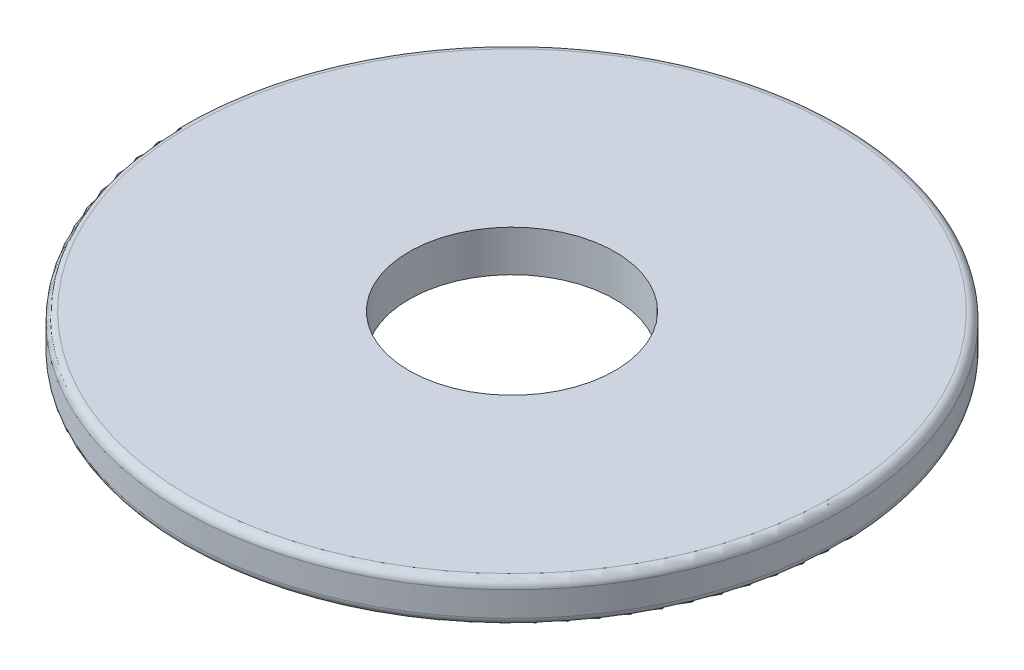
ISO-10303-21;
HEADER;
FILE_DESCRIPTION(('STEP AP214'),'2;1');
FILE_NAME('part.step','',(''),(''),'','','');
FILE_SCHEMA(('AUTOMOTIVE_DESIGN { 1 0 10303 214 1 1 1 1 }'));
ENDSEC;
DATA;
#1=APPLICATION_CONTEXT('core data for automotive mechanical design processes');
#2=APPLICATION_PROTOCOL_DEFINITION('international standard','automotive_design',2000,#1);
#3=PRODUCT_CONTEXT('',#1,'mechanical');
#4=PRODUCT('Part','Part','',(#3));
#5=PRODUCT_RELATED_PRODUCT_CATEGORY('part','',(#4));
#6=PRODUCT_DEFINITION_FORMATION('','',#4);
#7=PRODUCT_DEFINITION_CONTEXT('part definition',#1,'design');
#8=PRODUCT_DEFINITION('design','',#6,#7);
#9=PRODUCT_DEFINITION_SHAPE('','',#8);
#10=(LENGTH_UNIT() NAMED_UNIT(*) SI_UNIT(.MILLI.,.METRE.));
#11=(NAMED_UNIT(*) PLANE_ANGLE_UNIT() SI_UNIT($,.RADIAN.));
#12=(NAMED_UNIT(*) SI_UNIT($,.STERADIAN.) SOLID_ANGLE_UNIT());
#13=UNCERTAINTY_MEASURE_WITH_UNIT(LENGTH_MEASURE(1.E-05),#10,'distance_accuracy_value','');
#14=(GEOMETRIC_REPRESENTATION_CONTEXT(3) GLOBAL_UNCERTAINTY_ASSIGNED_CONTEXT((#13)) GLOBAL_UNIT_ASSIGNED_CONTEXT((#10,
#11,#12)) REPRESENTATION_CONTEXT('',''));
#15=CARTESIAN_POINT('',(0.,0.,0.));
#16=DIRECTION('',(0.,0.,1.));
#17=DIRECTION('',(1.,0.,0.));
#18=AXIS2_PLACEMENT_3D('',#15,#16,#17);
#19=CARTESIAN_POINT('',(0.,1.,0.));
#20=DIRECTION('',(0.,1.,0.));
#21=DIRECTION('',(0.,0.,1.));
#22=AXIS2_PLACEMENT_3D('',#19,#20,#21);
#23=PLANE('',#22);
#24=CARTESIAN_POINT('',(0.,1.,0.));
#25=DIRECTION('',(0.,1.,0.));
#26=DIRECTION('',(0.,0.,1.));
#27=AXIS2_PLACEMENT_3D('',#24,#25,#26);
#28=CIRCLE('',#27,7.8);
#29=CARTESIAN_POINT('',(0.,1.,7.8));
#30=VERTEX_POINT('',#29);
#31=EDGE_CURVE('E10',#30,#30,#28,.T.);
#32=ORIENTED_EDGE('',*,*,#31,.T.);
#33=EDGE_LOOP('',(#32));
#34=FACE_BOUND('',#33,.T.);
#35=CARTESIAN_POINT('',(0.,1.,0.));
#36=DIRECTION('',(0.,1.,0.));
#37=DIRECTION('',(0.,0.,1.));
#38=AXIS2_PLACEMENT_3D('',#35,#36,#37);
#39=CIRCLE('',#38,2.5);
#40=CARTESIAN_POINT('',(0.,1.,2.5));
#41=VERTEX_POINT('',#40);
#42=EDGE_CURVE('E53',#41,#41,#39,.T.);
#43=ORIENTED_EDGE('',*,*,#42,.F.);
#44=EDGE_LOOP('',(#43));
#45=FACE_BOUND('',#44,.T.);
#46=ADVANCED_FACE('F33',(#34,#45),#23,.T.);
#47=CARTESIAN_POINT('',(0.,0.,0.));
#48=DIRECTION('',(0.,1.,0.));
#49=DIRECTION('',(0.,0.,1.));
#50=AXIS2_PLACEMENT_3D('',#47,#48,#49);
#51=PLANE('',#50);
#52=CARTESIAN_POINT('',(0.,0.,0.));
#53=DIRECTION('',(0.,1.,0.));
#54=DIRECTION('',(0.,0.,1.));
#55=AXIS2_PLACEMENT_3D('',#52,#53,#54);
#56=CIRCLE('',#55,7.8);
#57=CARTESIAN_POINT('',(0.,0.,7.8));
#58=VERTEX_POINT('',#57);
#59=EDGE_CURVE('E40',#58,#58,#56,.F.);
#60=ORIENTED_EDGE('',*,*,#59,.T.);
#61=EDGE_LOOP('',(#60));
#62=FACE_BOUND('',#61,.T.);
#63=CARTESIAN_POINT('',(0.,0.,0.));
#64=DIRECTION('',(0.,1.,0.));
#65=DIRECTION('',(0.,0.,1.));
#66=AXIS2_PLACEMENT_3D('',#63,#64,#65);
#67=CIRCLE('',#66,2.5);
#68=CARTESIAN_POINT('',(0.,0.,2.5));
#69=VERTEX_POINT('',#68);
#70=EDGE_CURVE('E54',#69,#69,#67,.T.);
#71=ORIENTED_EDGE('',*,*,#70,.T.);
#72=EDGE_LOOP('',(#71));
#73=FACE_BOUND('',#72,.T.);
#74=ADVANCED_FACE('F64',(#62,#73),#51,.F.);
#75=CARTESIAN_POINT('',(0.,1.,0.));
#76=DIRECTION('',(0.,-1.,0.));
#77=DIRECTION('',(0.,0.,-1.));
#78=AXIS2_PLACEMENT_3D('',#75,#76,#77);
#79=CYLINDRICAL_SURFACE('',#78,8.);
#80=CARTESIAN_POINT('',(0.,0.2,0.));
#81=DIRECTION('',(0.,1.,0.));
#82=DIRECTION('',(0.,0.,1.));
#83=AXIS2_PLACEMENT_3D('',#80,#81,#82);
#84=CIRCLE('',#83,8.);
#85=CARTESIAN_POINT('',(0.,0.2,8.));
#86=VERTEX_POINT('',#85);
#87=EDGE_CURVE('E44',#86,#86,#84,.T.);
#88=ORIENTED_EDGE('',*,*,#87,.T.);
#89=EDGE_LOOP('',(#88));
#90=FACE_BOUND('',#89,.T.);
#91=CARTESIAN_POINT('',(0.,0.8,0.));
#92=DIRECTION('',(0.,1.,0.));
#93=DIRECTION('',(0.,0.,1.));
#94=AXIS2_PLACEMENT_3D('',#91,#92,#93);
#95=CIRCLE('',#94,8.);
#96=CARTESIAN_POINT('',(0.,0.8,8.));
#97=VERTEX_POINT('',#96);
#98=EDGE_CURVE('E48',#97,#97,#95,.F.);
#99=ORIENTED_EDGE('',*,*,#98,.T.);
#100=EDGE_LOOP('',(#99));
#101=FACE_BOUND('',#100,.T.);
#102=ADVANCED_FACE('F69',(#90,#101),#79,.T.);
#103=CARTESIAN_POINT('',(0.,1.,0.));
#104=DIRECTION('',(0.,-1.,0.));
#105=DIRECTION('',(0.,0.,-1.));
#106=AXIS2_PLACEMENT_3D('',#103,#104,#105);
#107=CYLINDRICAL_SURFACE('',#106,2.5);
#108=ORIENTED_EDGE('',*,*,#42,.T.);
#109=EDGE_LOOP('',(#108));
#110=FACE_BOUND('',#109,.T.);
#111=ORIENTED_EDGE('',*,*,#70,.F.);
#112=EDGE_LOOP('',(#111));
#113=FACE_BOUND('',#112,.T.);
#114=ADVANCED_FACE('F60',(#110,#113),#107,.F.);
#115=CARTESIAN_POINT('',(0.,0.2,0.));
#116=DIRECTION('',(0.,1.,0.));
#117=DIRECTION('',(0.,0.,1.));
#118=AXIS2_PLACEMENT_3D('',#115,#116,#117);
#119=TOROIDAL_SURFACE('',#118,7.8,0.2);
#120=ORIENTED_EDGE('',*,*,#59,.F.);
#121=EDGE_LOOP('',(#120));
#122=FACE_BOUND('',#121,.T.);
#123=ORIENTED_EDGE('',*,*,#87,.F.);
#124=EDGE_LOOP('',(#123));
#125=FACE_BOUND('',#124,.T.);
#126=ADVANCED_FACE('F75',(#122,#125),#119,.T.);
#127=CARTESIAN_POINT('',(0.,0.8,0.));
#128=DIRECTION('',(0.,1.,0.));
#129=DIRECTION('',(0.,0.,1.));
#130=AXIS2_PLACEMENT_3D('',#127,#128,#129);
#131=TOROIDAL_SURFACE('',#130,7.8,0.2);
#132=ORIENTED_EDGE('',*,*,#98,.F.);
#133=EDGE_LOOP('',(#132));
#134=FACE_BOUND('',#133,.T.);
#135=ORIENTED_EDGE('',*,*,#31,.F.);
#136=EDGE_LOOP('',(#135));
#137=FACE_BOUND('',#136,.T.);
#138=ADVANCED_FACE('F35',(#134,#137),#131,.T.);
#139=CLOSED_SHELL('',(#46,#74,#102,#114,#126,#138));
#140=MANIFOLD_SOLID_BREP('B2',#139);
#141=ADVANCED_BREP_SHAPE_REPRESENTATION('',(#18,#140),#14);
#142=SHAPE_DEFINITION_REPRESENTATION(#9,#141);
ENDSEC;
END-ISO-10303-21;
